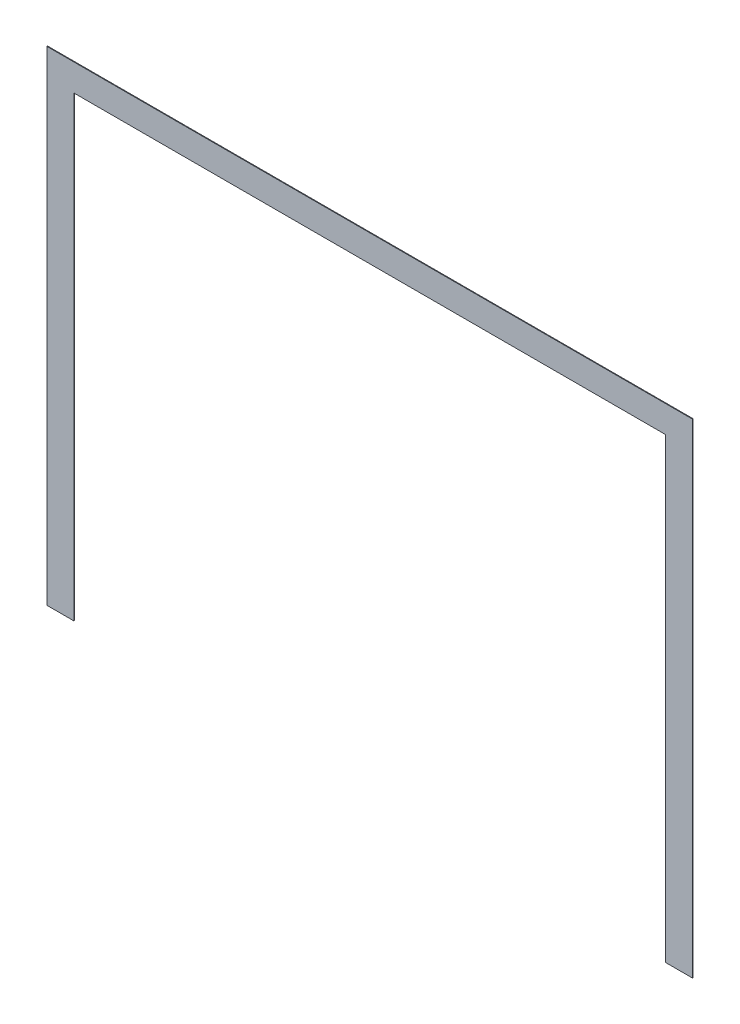
ISO-10303-21;
HEADER;
FILE_DESCRIPTION(('STEP AP214'),'2;1');
FILE_NAME('part.step','',(''),(''),'','','');
FILE_SCHEMA(('AUTOMOTIVE_DESIGN { 1 0 10303 214 1 1 1 1 }'));
ENDSEC;
DATA;
#1=APPLICATION_CONTEXT('core data for automotive mechanical design processes');
#2=APPLICATION_PROTOCOL_DEFINITION('international standard','automotive_design',2000,#1);
#3=PRODUCT_CONTEXT('',#1,'mechanical');
#4=PRODUCT('Part','Part','',(#3));
#5=PRODUCT_RELATED_PRODUCT_CATEGORY('part','',(#4));
#6=PRODUCT_DEFINITION_FORMATION('','',#4);
#7=PRODUCT_DEFINITION_CONTEXT('part definition',#1,'design');
#8=PRODUCT_DEFINITION('design','',#6,#7);
#9=PRODUCT_DEFINITION_SHAPE('','',#8);
#10=(LENGTH_UNIT() NAMED_UNIT(*) SI_UNIT(.MILLI.,.METRE.));
#11=(NAMED_UNIT(*) PLANE_ANGLE_UNIT() SI_UNIT($,.RADIAN.));
#12=(NAMED_UNIT(*) SI_UNIT($,.STERADIAN.) SOLID_ANGLE_UNIT());
#13=UNCERTAINTY_MEASURE_WITH_UNIT(LENGTH_MEASURE(1.E-05),#10,'distance_accuracy_value','');
#14=(GEOMETRIC_REPRESENTATION_CONTEXT(3) GLOBAL_UNCERTAINTY_ASSIGNED_CONTEXT((#13)) GLOBAL_UNIT_ASSIGNED_CONTEXT((#10,
#11,#12)) REPRESENTATION_CONTEXT('',''));
#15=CARTESIAN_POINT('',(0.,0.,0.));
#16=DIRECTION('',(0.,0.,1.));
#17=DIRECTION('',(1.,0.,0.));
#18=AXIS2_PLACEMENT_3D('',#15,#16,#17);
#19=CARTESIAN_POINT('',(-4203.86075973512,-2342.79235343933,0.));
#20=DIRECTION('',(0.,0.,1.));
#21=DIRECTION('',(1.,0.,0.));
#22=AXIS2_PLACEMENT_3D('',#19,#20,#21);
#23=PLANE('',#22);
#24=DIRECTION('',(0.,1.,0.));
#25=VECTOR('',#24,1.);
#26=CARTESIAN_POINT('',(-3594.26075973512,-2342.79235343933,0.));
#27=LINE('',#26,#25);
#28=CARTESIAN_POINT('',(-3594.26075973512,-2799.99235343932,0.));
#29=VERTEX_POINT('',#28);
#30=CARTESIAN_POINT('',(-3594.26075973512,-1885.59235343933,0.));
#31=VERTEX_POINT('',#30);
#32=EDGE_CURVE('E20',#29,#31,#27,.T.);
#33=ORIENTED_EDGE('',*,*,#32,.F.);
#34=DIRECTION('',(1.,0.,0.));
#35=VECTOR('',#34,1.);
#36=CARTESIAN_POINT('',(-3619.66075973512,-2799.99235343932,0.));
#37=LINE('',#36,#35);
#38=CARTESIAN_POINT('',(-3645.06075973512,-2799.99235343932,0.));
#39=VERTEX_POINT('',#38);
#40=EDGE_CURVE('E125',#39,#29,#37,.T.);
#41=ORIENTED_EDGE('',*,*,#40,.F.);
#42=DIRECTION('',(0.,1.,0.));
#43=VECTOR('',#42,1.);
#44=CARTESIAN_POINT('',(-3645.06075973512,-2368.19235343933,0.));
#45=LINE('',#44,#43);
#46=CARTESIAN_POINT('',(-3645.06075973512,-1936.39235343933,0.));
#47=VERTEX_POINT('',#46);
#48=EDGE_CURVE('E122',#47,#39,#45,.F.);
#49=ORIENTED_EDGE('',*,*,#48,.F.);
#50=DIRECTION('',(1.,0.,0.));
#51=VECTOR('',#50,1.);
#52=CARTESIAN_POINT('',(-4203.86075973512,-1936.39235343933,0.));
#53=LINE('',#52,#51);
#54=CARTESIAN_POINT('',(-4762.66075973512,-1936.39235343933,0.));
#55=VERTEX_POINT('',#54);
#56=EDGE_CURVE('E117',#55,#47,#53,.T.);
#57=ORIENTED_EDGE('',*,*,#56,.F.);
#58=DIRECTION('',(0.,1.,0.));
#59=VECTOR('',#58,1.);
#60=CARTESIAN_POINT('',(-4762.66075973512,-2368.19235343933,0.));
#61=LINE('',#60,#59);
#62=CARTESIAN_POINT('',(-4762.66075973512,-2799.99235343932,0.));
#63=VERTEX_POINT('',#62);
#64=EDGE_CURVE('E112',#63,#55,#61,.T.);
#65=ORIENTED_EDGE('',*,*,#64,.F.);
#66=DIRECTION('',(1.,0.,0.));
#67=VECTOR('',#66,1.);
#68=CARTESIAN_POINT('',(-4788.06075973512,-2799.99235343932,0.));
#69=LINE('',#68,#67);
#70=CARTESIAN_POINT('',(-4813.4607597351,-2799.99235343932,0.));
#71=VERTEX_POINT('',#70);
#72=EDGE_CURVE('E107',#71,#63,#69,.T.);
#73=ORIENTED_EDGE('',*,*,#72,.F.);
#74=DIRECTION('',(0.,1.,0.));
#75=VECTOR('',#74,1.);
#76=CARTESIAN_POINT('',(-4813.4607597351,-2342.79235343933,0.));
#77=LINE('',#76,#75);
#78=CARTESIAN_POINT('',(-4813.4607597351,-1885.59235343933,0.));
#79=VERTEX_POINT('',#78);
#80=EDGE_CURVE('E93',#79,#71,#77,.F.);
#81=ORIENTED_EDGE('',*,*,#80,.F.);
#82=DIRECTION('',(1.,0.,0.));
#83=VECTOR('',#82,1.);
#84=CARTESIAN_POINT('',(-4203.86075973512,-1885.59235343933,0.));
#85=LINE('',#84,#83);
#86=EDGE_CURVE('E79',#31,#79,#85,.F.);
#87=ORIENTED_EDGE('',*,*,#86,.F.);
#88=EDGE_LOOP('',(#33,#41,#49,#57,#65,#73,#81,#87));
#89=FACE_BOUND('',#88,.T.);
#90=ADVANCED_FACE('F17',(#89),#23,.F.);
#91=CARTESIAN_POINT('',(-3594.26075973512,-2342.79235343933,3.175));
#92=DIRECTION('',(1.,0.,0.));
#93=DIRECTION('',(0.,0.,-1.));
#94=AXIS2_PLACEMENT_3D('',#91,#92,#93);
#95=PLANE('',#94);
#96=ORIENTED_EDGE('',*,*,#32,.T.);
#97=DIRECTION('',(0.,0.,1.));
#98=VECTOR('',#97,1.);
#99=CARTESIAN_POINT('',(-3594.26075973512,-1885.59235343933,3.175));
#100=LINE('',#99,#98);
#101=CARTESIAN_POINT('',(-3594.26075973512,-1885.59235343933,1.27));
#102=VERTEX_POINT('',#101);
#103=EDGE_CURVE('E85',#102,#31,#100,.F.);
#104=ORIENTED_EDGE('',*,*,#103,.F.);
#105=DIRECTION('',(0.,1.,0.));
#106=VECTOR('',#105,1.);
#107=CARTESIAN_POINT('',(-3594.26075973512,-2342.79235343933,1.27));
#108=LINE('',#107,#106);
#109=CARTESIAN_POINT('',(-3594.26075973512,-2799.99235343932,1.27));
#110=VERTEX_POINT('',#109);
#111=EDGE_CURVE('E128',#110,#102,#108,.T.);
#112=ORIENTED_EDGE('',*,*,#111,.F.);
#113=DIRECTION('',(0.,0.,-1.));
#114=VECTOR('',#113,1.);
#115=CARTESIAN_POINT('',(-3594.26075973512,-2799.99235343932,3.175));
#116=LINE('',#115,#114);
#117=EDGE_CURVE('E88',#29,#110,#116,.F.);
#118=ORIENTED_EDGE('',*,*,#117,.F.);
#119=EDGE_LOOP('',(#96,#104,#112,#118));
#120=FACE_BOUND('',#119,.T.);
#121=ADVANCED_FACE('F84',(#120),#95,.T.);
#122=CARTESIAN_POINT('',(-4203.86075973512,-1885.59235343933,3.175));
#123=DIRECTION('',(0.,1.,0.));
#124=DIRECTION('',(0.,0.,1.));
#125=AXIS2_PLACEMENT_3D('',#122,#123,#124);
#126=PLANE('',#125);
#127=ORIENTED_EDGE('',*,*,#86,.T.);
#128=DIRECTION('',(0.,0.,1.));
#129=VECTOR('',#128,1.);
#130=CARTESIAN_POINT('',(-4813.4607597351,-1885.59235343933,3.175));
#131=LINE('',#130,#129);
#132=CARTESIAN_POINT('',(-4813.4607597351,-1885.59235343933,1.27));
#133=VERTEX_POINT('',#132);
#134=EDGE_CURVE('E95',#133,#79,#131,.F.);
#135=ORIENTED_EDGE('',*,*,#134,.F.);
#136=DIRECTION('',(1.,0.,0.));
#137=VECTOR('',#136,1.);
#138=CARTESIAN_POINT('',(-4203.86075973512,-1885.59235343933,1.27));
#139=LINE('',#138,#137);
#140=EDGE_CURVE('E99',#102,#133,#139,.F.);
#141=ORIENTED_EDGE('',*,*,#140,.F.);
#142=ORIENTED_EDGE('',*,*,#103,.T.);
#143=EDGE_LOOP('',(#127,#135,#141,#142));
#144=FACE_BOUND('',#143,.T.);
#145=ADVANCED_FACE('F97',(#144),#126,.T.);
#146=CARTESIAN_POINT('',(-4813.4607597351,-2342.79235343933,3.175));
#147=DIRECTION('',(-1.,0.,0.));
#148=DIRECTION('',(0.,0.,1.));
#149=AXIS2_PLACEMENT_3D('',#146,#147,#148);
#150=PLANE('',#149);
#151=ORIENTED_EDGE('',*,*,#80,.T.);
#152=DIRECTION('',(0.,0.,-1.));
#153=VECTOR('',#152,1.);
#154=CARTESIAN_POINT('',(-4813.4607597351,-2799.99235343932,3.175));
#155=LINE('',#154,#153);
#156=CARTESIAN_POINT('',(-4813.4607597351,-2799.99235343932,1.27));
#157=VERTEX_POINT('',#156);
#158=EDGE_CURVE('E104',#157,#71,#155,.T.);
#159=ORIENTED_EDGE('',*,*,#158,.F.);
#160=DIRECTION('',(0.,1.,0.));
#161=VECTOR('',#160,1.);
#162=CARTESIAN_POINT('',(-4813.4607597351,-2342.79235343933,1.27));
#163=LINE('',#162,#161);
#164=EDGE_CURVE('E131',#133,#157,#163,.F.);
#165=ORIENTED_EDGE('',*,*,#164,.F.);
#166=ORIENTED_EDGE('',*,*,#134,.T.);
#167=EDGE_LOOP('',(#151,#159,#165,#166));
#168=FACE_BOUND('',#167,.T.);
#169=ADVANCED_FACE('F174',(#168),#150,.T.);
#170=CARTESIAN_POINT('',(-4788.06075973512,-2799.99235343932,3.175));
#171=DIRECTION('',(0.,-1.,0.));
#172=DIRECTION('',(0.,0.,-1.));
#173=AXIS2_PLACEMENT_3D('',#170,#171,#172);
#174=PLANE('',#173);
#175=ORIENTED_EDGE('',*,*,#72,.T.);
#176=DIRECTION('',(0.,0.,-1.));
#177=VECTOR('',#176,1.);
#178=CARTESIAN_POINT('',(-4762.66075973512,-2799.99235343932,3.175));
#179=LINE('',#178,#177);
#180=CARTESIAN_POINT('',(-4762.66075973512,-2799.99235343932,1.27));
#181=VERTEX_POINT('',#180);
#182=EDGE_CURVE('E109',#181,#63,#179,.T.);
#183=ORIENTED_EDGE('',*,*,#182,.F.);
#184=DIRECTION('',(1.,0.,0.));
#185=VECTOR('',#184,1.);
#186=CARTESIAN_POINT('',(-4203.86075973512,-2799.99235343932,1.27));
#187=LINE('',#186,#185);
#188=EDGE_CURVE('E134',#157,#181,#187,.T.);
#189=ORIENTED_EDGE('',*,*,#188,.F.);
#190=ORIENTED_EDGE('',*,*,#158,.T.);
#191=EDGE_LOOP('',(#175,#183,#189,#190));
#192=FACE_BOUND('',#191,.T.);
#193=ADVANCED_FACE('F170',(#192),#174,.T.);
#194=CARTESIAN_POINT('',(-4762.66075973512,-2368.19235343933,3.175));
#195=DIRECTION('',(1.,0.,0.));
#196=DIRECTION('',(0.,0.,-1.));
#197=AXIS2_PLACEMENT_3D('',#194,#195,#196);
#198=PLANE('',#197);
#199=ORIENTED_EDGE('',*,*,#64,.T.);
#200=DIRECTION('',(0.,0.,-1.));
#201=VECTOR('',#200,1.);
#202=CARTESIAN_POINT('',(-4762.66075973512,-1936.39235343933,3.175));
#203=LINE('',#202,#201);
#204=CARTESIAN_POINT('',(-4762.66075973512,-1936.39235343933,1.27));
#205=VERTEX_POINT('',#204);
#206=EDGE_CURVE('E114',#205,#55,#203,.T.);
#207=ORIENTED_EDGE('',*,*,#206,.F.);
#208=DIRECTION('',(0.,1.,0.));
#209=VECTOR('',#208,1.);
#210=CARTESIAN_POINT('',(-4762.66075973512,-2342.79235343933,1.27));
#211=LINE('',#210,#209);
#212=EDGE_CURVE('E137',#181,#205,#211,.T.);
#213=ORIENTED_EDGE('',*,*,#212,.F.);
#214=ORIENTED_EDGE('',*,*,#182,.T.);
#215=EDGE_LOOP('',(#199,#207,#213,#214));
#216=FACE_BOUND('',#215,.T.);
#217=ADVANCED_FACE('F167',(#216),#198,.T.);
#218=CARTESIAN_POINT('',(-4203.86075973512,-1936.39235343933,3.175));
#219=DIRECTION('',(0.,-1.,0.));
#220=DIRECTION('',(0.,0.,-1.));
#221=AXIS2_PLACEMENT_3D('',#218,#219,#220);
#222=PLANE('',#221);
#223=ORIENTED_EDGE('',*,*,#56,.T.);
#224=DIRECTION('',(0.,0.,1.));
#225=VECTOR('',#224,1.);
#226=CARTESIAN_POINT('',(-3645.06075973512,-1936.39235343933,3.175));
#227=LINE('',#226,#225);
#228=CARTESIAN_POINT('',(-3645.06075973512,-1936.39235343933,1.27));
#229=VERTEX_POINT('',#228);
#230=EDGE_CURVE('E119',#229,#47,#227,.F.);
#231=ORIENTED_EDGE('',*,*,#230,.F.);
#232=DIRECTION('',(1.,0.,0.));
#233=VECTOR('',#232,1.);
#234=CARTESIAN_POINT('',(-4203.86075973512,-1936.39235343933,1.27));
#235=LINE('',#234,#233);
#236=EDGE_CURVE('E140',#205,#229,#235,.T.);
#237=ORIENTED_EDGE('',*,*,#236,.F.);
#238=ORIENTED_EDGE('',*,*,#206,.T.);
#239=EDGE_LOOP('',(#223,#231,#237,#238));
#240=FACE_BOUND('',#239,.T.);
#241=ADVANCED_FACE('F150',(#240),#222,.T.);
#242=CARTESIAN_POINT('',(-3645.06075973512,-2368.19235343933,3.175));
#243=DIRECTION('',(-1.,0.,0.));
#244=DIRECTION('',(0.,0.,1.));
#245=AXIS2_PLACEMENT_3D('',#242,#243,#244);
#246=PLANE('',#245);
#247=ORIENTED_EDGE('',*,*,#48,.T.);
#248=DIRECTION('',(0.,0.,-1.));
#249=VECTOR('',#248,1.);
#250=CARTESIAN_POINT('',(-3645.06075973512,-2799.99235343932,3.175));
#251=LINE('',#250,#249);
#252=CARTESIAN_POINT('',(-3645.06075973512,-2799.99235343932,1.27));
#253=VERTEX_POINT('',#252);
#254=EDGE_CURVE('E35',#253,#39,#251,.T.);
#255=ORIENTED_EDGE('',*,*,#254,.F.);
#256=DIRECTION('',(0.,1.,0.));
#257=VECTOR('',#256,1.);
#258=CARTESIAN_POINT('',(-3645.06075973512,-2342.79235343933,1.27));
#259=LINE('',#258,#257);
#260=EDGE_CURVE('E26',#229,#253,#259,.F.);
#261=ORIENTED_EDGE('',*,*,#260,.F.);
#262=ORIENTED_EDGE('',*,*,#230,.T.);
#263=EDGE_LOOP('',(#247,#255,#261,#262));
#264=FACE_BOUND('',#263,.T.);
#265=ADVANCED_FACE('F147',(#264),#246,.T.);
#266=CARTESIAN_POINT('',(-3619.66075973512,-2799.99235343932,3.175));
#267=DIRECTION('',(0.,-1.,0.));
#268=DIRECTION('',(0.,0.,-1.));
#269=AXIS2_PLACEMENT_3D('',#266,#267,#268);
#270=PLANE('',#269);
#271=ORIENTED_EDGE('',*,*,#40,.T.);
#272=ORIENTED_EDGE('',*,*,#117,.T.);
#273=DIRECTION('',(1.,0.,0.));
#274=VECTOR('',#273,1.);
#275=CARTESIAN_POINT('',(-4203.86075973512,-2799.99235343932,1.27));
#276=LINE('',#275,#274);
#277=EDGE_CURVE('E11',#253,#110,#276,.T.);
#278=ORIENTED_EDGE('',*,*,#277,.F.);
#279=ORIENTED_EDGE('',*,*,#254,.T.);
#280=EDGE_LOOP('',(#271,#272,#278,#279));
#281=FACE_BOUND('',#280,.T.);
#282=ADVANCED_FACE('F154',(#281),#270,.T.);
#283=CARTESIAN_POINT('',(-4203.86075973512,-2342.79235343933,1.27));
#284=DIRECTION('',(0.,0.,1.));
#285=DIRECTION('',(1.,0.,0.));
#286=AXIS2_PLACEMENT_3D('',#283,#284,#285);
#287=PLANE('',#286);
#288=ORIENTED_EDGE('',*,*,#260,.T.);
#289=ORIENTED_EDGE('',*,*,#277,.T.);
#290=ORIENTED_EDGE('',*,*,#111,.T.);
#291=ORIENTED_EDGE('',*,*,#140,.T.);
#292=ORIENTED_EDGE('',*,*,#164,.T.);
#293=ORIENTED_EDGE('',*,*,#188,.T.);
#294=ORIENTED_EDGE('',*,*,#212,.T.);
#295=ORIENTED_EDGE('',*,*,#236,.T.);
#296=EDGE_LOOP('',(#288,#289,#290,#291,#292,#293,#294,#295));
#297=FACE_BOUND('',#296,.T.);
#298=ADVANCED_FACE('F145',(#297),#287,.T.);
#299=CLOSED_SHELL('',(#90,#121,#145,#169,#193,#217,#241,#265,#282,#298));
#300=MANIFOLD_SOLID_BREP('B1',#299);
#301=ADVANCED_BREP_SHAPE_REPRESENTATION('',(#18,#300),#14);
#302=SHAPE_DEFINITION_REPRESENTATION(#9,#301);
ENDSEC;
END-ISO-10303-21;
